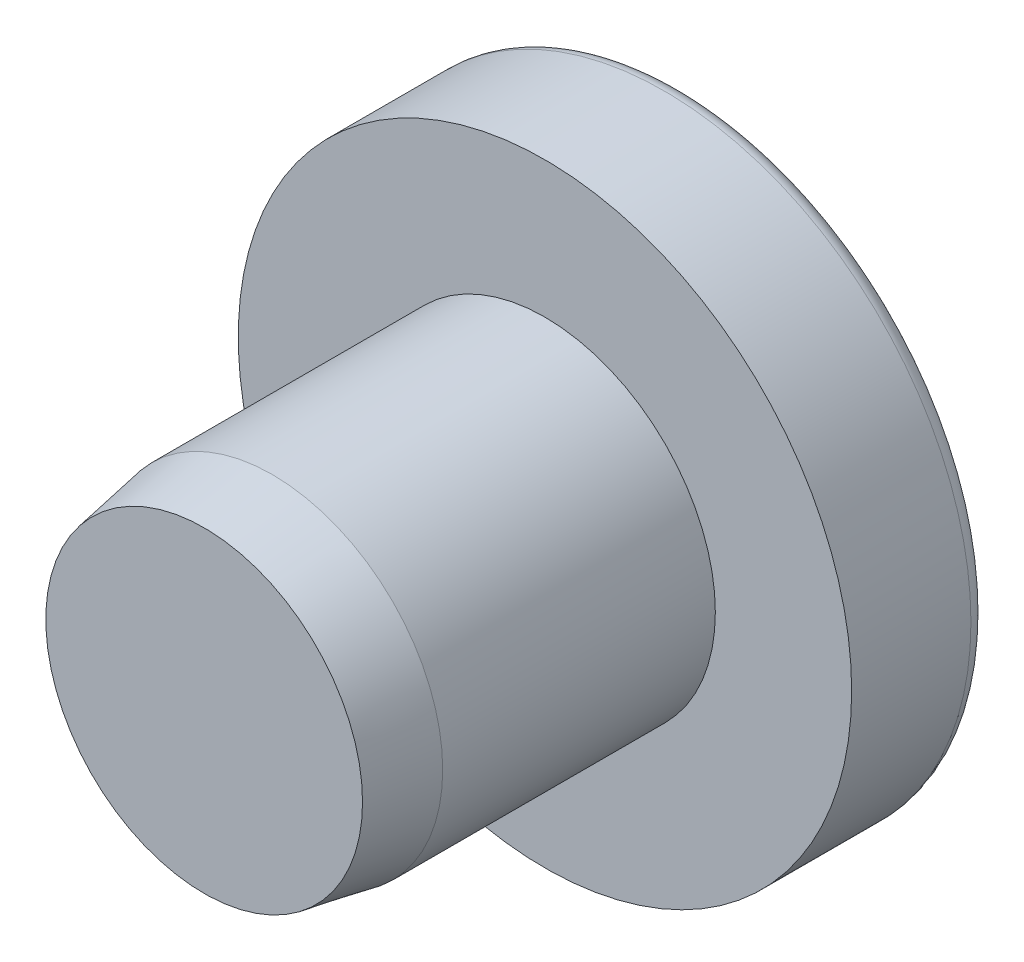
ISO-10303-21;
HEADER;
FILE_DESCRIPTION(('STEP AP214'),'2;1');
FILE_NAME('part.step','',(''),(''),'','','');
FILE_SCHEMA(('AUTOMOTIVE_DESIGN { 1 0 10303 214 1 1 1 1 }'));
ENDSEC;
DATA;
#1=APPLICATION_CONTEXT('core data for automotive mechanical design processes');
#2=APPLICATION_PROTOCOL_DEFINITION('international standard','automotive_design',2000,#1);
#3=PRODUCT_CONTEXT('',#1,'mechanical');
#4=PRODUCT('Part','Part','',(#3));
#5=PRODUCT_RELATED_PRODUCT_CATEGORY('part','',(#4));
#6=PRODUCT_DEFINITION_FORMATION('','',#4);
#7=PRODUCT_DEFINITION_CONTEXT('part definition',#1,'design');
#8=PRODUCT_DEFINITION('design','',#6,#7);
#9=PRODUCT_DEFINITION_SHAPE('','',#8);
#10=(LENGTH_UNIT() NAMED_UNIT(*) SI_UNIT(.MILLI.,.METRE.));
#11=(NAMED_UNIT(*) PLANE_ANGLE_UNIT() SI_UNIT($,.RADIAN.));
#12=(NAMED_UNIT(*) SI_UNIT($,.STERADIAN.) SOLID_ANGLE_UNIT());
#13=UNCERTAINTY_MEASURE_WITH_UNIT(LENGTH_MEASURE(1.E-05),#10,'distance_accuracy_value','');
#14=(GEOMETRIC_REPRESENTATION_CONTEXT(3) GLOBAL_UNCERTAINTY_ASSIGNED_CONTEXT((#13)) GLOBAL_UNIT_ASSIGNED_CONTEXT((#10,
#11,#12)) REPRESENTATION_CONTEXT('',''));
#15=CARTESIAN_POINT('',(0.,0.,0.));
#16=DIRECTION('',(0.,0.,1.));
#17=DIRECTION('',(1.,0.,0.));
#18=AXIS2_PLACEMENT_3D('',#15,#16,#17);
#19=CARTESIAN_POINT('',(0.,0.,4.));
#20=DIRECTION('',(0.,0.,1.));
#21=DIRECTION('',(1.,0.,0.));
#22=AXIS2_PLACEMENT_3D('',#19,#20,#21);
#23=PLANE('',#22);
#24=CARTESIAN_POINT('',(0.,0.,4.));
#25=DIRECTION('',(0.,0.,1.));
#26=DIRECTION('',(1.,0.,0.));
#27=AXIS2_PLACEMENT_3D('',#24,#25,#26);
#28=CIRCLE('',#27,9.);
#29=CARTESIAN_POINT('',(9.,0.,4.));
#30=VERTEX_POINT('',#29);
#31=EDGE_CURVE('E53',#30,#30,#28,.T.);
#32=ORIENTED_EDGE('',*,*,#31,.T.);
#33=EDGE_LOOP('',(#32));
#34=FACE_BOUND('',#33,.T.);
#35=CARTESIAN_POINT('',(0.,0.,4.));
#36=DIRECTION('',(0.,0.,1.));
#37=DIRECTION('',(1.,0.,0.));
#38=AXIS2_PLACEMENT_3D('',#35,#36,#37);
#39=CIRCLE('',#38,5.);
#40=CARTESIAN_POINT('',(5.,0.,4.));
#41=VERTEX_POINT('',#40);
#42=EDGE_CURVE('E56',#41,#41,#39,.T.);
#43=ORIENTED_EDGE('',*,*,#42,.F.);
#44=EDGE_LOOP('',(#43));
#45=FACE_BOUND('',#44,.T.);
#46=ADVANCED_FACE('F33',(#34,#45),#23,.T.);
#47=CARTESIAN_POINT('',(0.,0.,4.));
#48=DIRECTION('',(0.,0.,-1.));
#49=DIRECTION('',(-1.,0.,0.));
#50=AXIS2_PLACEMENT_3D('',#47,#48,#49);
#51=CYLINDRICAL_SURFACE('',#50,9.);
#52=CARTESIAN_POINT('',(0.,0.,0.5));
#53=DIRECTION('',(0.,0.,1.));
#54=DIRECTION('',(1.,0.,0.));
#55=AXIS2_PLACEMENT_3D('',#52,#53,#54);
#56=CIRCLE('',#55,9.);
#57=CARTESIAN_POINT('',(9.,0.,0.5));
#58=VERTEX_POINT('',#57);
#59=EDGE_CURVE('E48',#58,#58,#56,.T.);
#60=ORIENTED_EDGE('',*,*,#59,.T.);
#61=EDGE_LOOP('',(#60));
#62=FACE_BOUND('',#61,.T.);
#63=ORIENTED_EDGE('',*,*,#31,.F.);
#64=EDGE_LOOP('',(#63));
#65=FACE_BOUND('',#64,.T.);
#66=ADVANCED_FACE('F63',(#62,#65),#51,.T.);
#67=CARTESIAN_POINT('',(0.,0.,0.));
#68=DIRECTION('',(0.,0.,1.));
#69=DIRECTION('',(1.,0.,0.));
#70=AXIS2_PLACEMENT_3D('',#67,#68,#69);
#71=PLANE('',#70);
#72=CARTESIAN_POINT('',(0.,0.,0.));
#73=DIRECTION('',(0.,0.,1.));
#74=DIRECTION('',(1.,0.,0.));
#75=AXIS2_PLACEMENT_3D('',#72,#73,#74);
#76=CIRCLE('',#75,8.5);
#77=CARTESIAN_POINT('',(8.5,0.,0.));
#78=VERTEX_POINT('',#77);
#79=EDGE_CURVE('E44',#78,#78,#76,.F.);
#80=ORIENTED_EDGE('',*,*,#79,.T.);
#81=EDGE_LOOP('',(#80));
#82=FACE_BOUND('',#81,.T.);
#83=ADVANCED_FACE('F69',(#82),#71,.F.);
#84=CARTESIAN_POINT('',(0.,0.,14.));
#85=DIRECTION('',(0.,0.,-1.));
#86=DIRECTION('',(-1.,0.,0.));
#87=AXIS2_PLACEMENT_3D('',#84,#85,#86);
#88=CYLINDRICAL_SURFACE('',#87,5.);
#89=CARTESIAN_POINT('',(0.,0.,12.));
#90=DIRECTION('',(0.,0.,1.));
#91=DIRECTION('',(1.,0.,0.));
#92=AXIS2_PLACEMENT_3D('',#89,#90,#91);
#93=CIRCLE('',#92,5.);
#94=CARTESIAN_POINT('',(5.,0.,12.));
#95=VERTEX_POINT('',#94);
#96=EDGE_CURVE('E10',#95,#95,#93,.F.);
#97=ORIENTED_EDGE('',*,*,#96,.T.);
#98=EDGE_LOOP('',(#97));
#99=FACE_BOUND('',#98,.T.);
#100=ORIENTED_EDGE('',*,*,#42,.T.);
#101=EDGE_LOOP('',(#100));
#102=FACE_BOUND('',#101,.T.);
#103=ADVANCED_FACE('F60',(#99,#102),#88,.T.);
#104=CARTESIAN_POINT('',(0.,0.,14.));
#105=DIRECTION('',(0.,0.,1.));
#106=DIRECTION('',(1.,0.,0.));
#107=AXIS2_PLACEMENT_3D('',#104,#105,#106);
#108=PLANE('',#107);
#109=CARTESIAN_POINT('',(0.,0.,14.));
#110=DIRECTION('',(0.,0.,1.));
#111=DIRECTION('',(1.,0.,0.));
#112=AXIS2_PLACEMENT_3D('',#109,#110,#111);
#113=CIRCLE('',#112,4.64734603858307);
#114=CARTESIAN_POINT('',(4.64734603858307,0.,14.));
#115=VERTEX_POINT('',#114);
#116=EDGE_CURVE('E40',#115,#115,#113,.T.);
#117=ORIENTED_EDGE('',*,*,#116,.T.);
#118=EDGE_LOOP('',(#117));
#119=FACE_BOUND('',#118,.T.);
#120=ADVANCED_FACE('F79',(#119),#108,.T.);
#121=CARTESIAN_POINT('',(0.,0.,0.5));
#122=DIRECTION('',(0.,0.,1.));
#123=DIRECTION('',(1.,0.,0.));
#124=AXIS2_PLACEMENT_3D('',#121,#122,#123);
#125=TOROIDAL_SURFACE('',#124,8.5,0.5);
#126=ORIENTED_EDGE('',*,*,#79,.F.);
#127=EDGE_LOOP('',(#126));
#128=FACE_BOUND('',#127,.T.);
#129=ORIENTED_EDGE('',*,*,#59,.F.);
#130=EDGE_LOOP('',(#129));
#131=FACE_BOUND('',#130,.T.);
#132=ADVANCED_FACE('F77',(#128,#131),#125,.T.);
#133=CARTESIAN_POINT('',(0.,0.,14.));
#134=DIRECTION('',(0.,0.,-1.));
#135=DIRECTION('',(-1.,0.,0.));
#136=AXIS2_PLACEMENT_3D('',#133,#134,#135);
#137=CONICAL_SURFACE('',#136,4.64734603858307,0.17453292519943);
#138=ORIENTED_EDGE('',*,*,#96,.F.);
#139=EDGE_LOOP('',(#138));
#140=FACE_BOUND('',#139,.T.);
#141=ORIENTED_EDGE('',*,*,#116,.F.);
#142=EDGE_LOOP('',(#141));
#143=FACE_BOUND('',#142,.T.);
#144=ADVANCED_FACE('F35',(#140,#143),#137,.T.);
#145=CLOSED_SHELL('',(#46,#66,#83,#103,#120,#132,#144));
#146=MANIFOLD_SOLID_BREP('B2',#145);
#147=ADVANCED_BREP_SHAPE_REPRESENTATION('',(#18,#146),#14);
#148=SHAPE_DEFINITION_REPRESENTATION(#9,#147);
ENDSEC;
END-ISO-10303-21;
